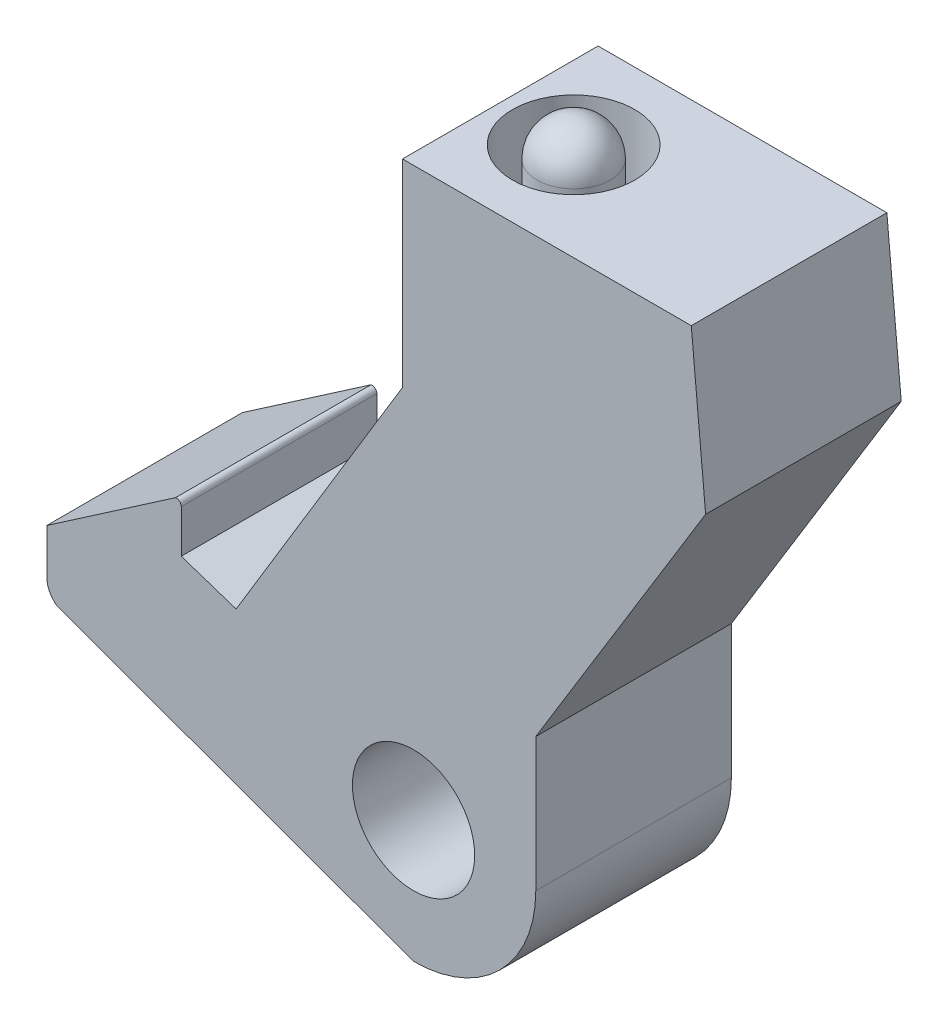
ISO-10303-21;
HEADER;
FILE_DESCRIPTION(('STEP AP214'),'2;1');
FILE_NAME('part.step','',(''),(''),'','','');
FILE_SCHEMA(('AUTOMOTIVE_DESIGN { 1 0 10303 214 1 1 1 1 }'));
ENDSEC;
DATA;
#1=APPLICATION_CONTEXT('core data for automotive mechanical design processes');
#2=APPLICATION_PROTOCOL_DEFINITION('international standard','automotive_design',2000,#1);
#3=PRODUCT_CONTEXT('',#1,'mechanical');
#4=PRODUCT('Part','Part','',(#3));
#5=PRODUCT_RELATED_PRODUCT_CATEGORY('part','',(#4));
#6=PRODUCT_DEFINITION_FORMATION('','',#4);
#7=PRODUCT_DEFINITION_CONTEXT('part definition',#1,'design');
#8=PRODUCT_DEFINITION('design','',#6,#7);
#9=PRODUCT_DEFINITION_SHAPE('','',#8);
#10=(LENGTH_UNIT() NAMED_UNIT(*) SI_UNIT(.MILLI.,.METRE.));
#11=(NAMED_UNIT(*) PLANE_ANGLE_UNIT() SI_UNIT($,.RADIAN.));
#12=(NAMED_UNIT(*) SI_UNIT($,.STERADIAN.) SOLID_ANGLE_UNIT());
#13=UNCERTAINTY_MEASURE_WITH_UNIT(LENGTH_MEASURE(1.E-05),#10,'distance_accuracy_value','');
#14=(GEOMETRIC_REPRESENTATION_CONTEXT(3) GLOBAL_UNCERTAINTY_ASSIGNED_CONTEXT((#13)) GLOBAL_UNIT_ASSIGNED_CONTEXT((#10,
#11,#12)) REPRESENTATION_CONTEXT('',''));
#15=CARTESIAN_POINT('',(0.,0.,0.));
#16=DIRECTION('',(0.,0.,1.));
#17=DIRECTION('',(1.,0.,0.));
#18=AXIS2_PLACEMENT_3D('',#15,#16,#17);
#19=CARTESIAN_POINT('',(-9.7,6.35896081746884,8.));
#20=DIRECTION('',(0.,0.,-1.));
#21=DIRECTION('',(-1.,0.,0.));
#22=AXIS2_PLACEMENT_3D('',#19,#20,#21);
#23=PLANE('',#22);
#24=DIRECTION('',(-1.,0.,0.));
#25=VECTOR('',#24,1.);
#26=CARTESIAN_POINT('',(11.3590150208079,23.1958998029611,8.));
#27=LINE('',#26,#25);
#28=CARTESIAN_POINT('',(11.3590150208079,23.1958998029611,8.));
#29=VERTEX_POINT('',#28);
#30=CARTESIAN_POINT('',(-0.451148657404046,23.1958998029611,8.));
#31=VERTEX_POINT('',#30);
#32=EDGE_CURVE('E194',#29,#31,#27,.T.);
#33=ORIENTED_EDGE('',*,*,#32,.T.);
#34=DIRECTION('',(0.,-1.,0.));
#35=VECTOR('',#34,1.);
#36=CARTESIAN_POINT('',(-0.451148657404047,21.8755314878272,8.));
#37=LINE('',#36,#35);
#38=CARTESIAN_POINT('',(-0.451148657404047,15.1014958015658,8.));
#39=VERTEX_POINT('',#38);
#40=EDGE_CURVE('E111',#31,#39,#37,.T.);
#41=ORIENTED_EDGE('',*,*,#40,.T.);
#42=DIRECTION('',(-0.517671811469476,-0.855579274883346,0.));
#43=VECTOR('',#42,1.);
#44=CARTESIAN_POINT('',(-7.25812043141713,3.85131017135029,8.));
#45=LINE('',#44,#43);
#46=CARTESIAN_POINT('',(-7.25812043141713,3.85131017135029,8.));
#47=VERTEX_POINT('',#46);
#48=EDGE_CURVE('E319',#39,#47,#45,.T.);
#49=ORIENTED_EDGE('',*,*,#48,.T.);
#50=DIRECTION('',(-0.948683298050514,0.316227766016838,0.));
#51=VECTOR('',#50,1.);
#52=CARTESIAN_POINT('',(-7.25812043141713,3.85131017135029,8.));
#53=LINE('',#52,#51);
#54=CARTESIAN_POINT('',(-9.5,4.59860336087792,8.));
#55=VERTEX_POINT('',#54);
#56=EDGE_CURVE('E321',#47,#55,#53,.T.);
#57=ORIENTED_EDGE('',*,*,#56,.T.);
#58=DIRECTION('',(0.,1.,0.));
#59=VECTOR('',#58,1.);
#60=CARTESIAN_POINT('',(-9.5,6.35896081746884,8.));
#61=LINE('',#60,#59);
#62=CARTESIAN_POINT('',(-9.5,6.35896081746884,8.));
#63=VERTEX_POINT('',#62);
#64=EDGE_CURVE('E323',#55,#63,#61,.T.);
#65=ORIENTED_EDGE('',*,*,#64,.T.);
#66=CARTESIAN_POINT('',(-9.7,6.35896081746884,8.));
#67=DIRECTION('',(0.,0.,1.));
#68=DIRECTION('',(-1.,0.,0.));
#69=AXIS2_PLACEMENT_3D('',#66,#67,#68);
#70=CIRCLE('',#69,0.200000000000001);
#71=CARTESIAN_POINT('',(-9.73577708764,6.55573479948883,8.));
#72=VERTEX_POINT('',#71);
#73=EDGE_CURVE('E329',#63,#72,#70,.T.);
#74=ORIENTED_EDGE('',*,*,#73,.T.);
#75=DIRECTION('',(-0.824143897152437,-0.566380469990265,0.));
#76=VECTOR('',#75,1.);
#77=CARTESIAN_POINT('',(-9.73577708764,6.55573479948883,8.));
#78=LINE('',#77,#76);
#79=CARTESIAN_POINT('',(-15.,2.93797695703222,8.));
#80=VERTEX_POINT('',#79);
#81=EDGE_CURVE('E331',#72,#80,#78,.T.);
#82=ORIENTED_EDGE('',*,*,#81,.T.);
#83=DIRECTION('',(0.,-1.,0.));
#84=VECTOR('',#83,1.);
#85=CARTESIAN_POINT('',(-15.,1.11192690659553,8.));
#86=LINE('',#85,#84);
#87=CARTESIAN_POINT('',(-15.,1.11192690659553,8.));
#88=VERTEX_POINT('',#87);
#89=EDGE_CURVE('E333',#80,#88,#86,.T.);
#90=ORIENTED_EDGE('',*,*,#89,.T.);
#91=CARTESIAN_POINT('',(-14.,1.11192690659553,8.));
#92=DIRECTION('',(0.,0.,1.));
#93=DIRECTION('',(-1.,0.,0.));
#94=AXIS2_PLACEMENT_3D('',#91,#92,#93);
#95=CIRCLE('',#94,1.);
#96=CARTESIAN_POINT('',(-14.5829032987937,0.299385372730662,8.));
#97=VERTEX_POINT('',#96);
#98=EDGE_CURVE('E335',#88,#97,#95,.T.);
#99=ORIENTED_EDGE('',*,*,#98,.T.);
#100=DIRECTION('',(0.939865612839729,-0.341544477047134,0.));
#101=VECTOR('',#100,1.);
#102=CARTESIAN_POINT('',(-14.5829032987937,0.299385372730663,8.));
#103=LINE('',#102,#101);
#104=CARTESIAN_POINT('',(0.,-5.,8.));
#105=VERTEX_POINT('',#104);
#106=EDGE_CURVE('E337',#97,#105,#103,.T.);
#107=ORIENTED_EDGE('',*,*,#106,.T.);
#108=CARTESIAN_POINT('',(0.,0.,8.));
#109=DIRECTION('',(0.,0.,1.));
#110=DIRECTION('',(1.,0.,0.));
#111=AXIS2_PLACEMENT_3D('',#108,#109,#110);
#112=CIRCLE('',#111,5.);
#113=CARTESIAN_POINT('',(5.,0.,8.));
#114=VERTEX_POINT('',#113);
#115=EDGE_CURVE('E148',#105,#114,#112,.T.);
#116=ORIENTED_EDGE('',*,*,#115,.T.);
#117=DIRECTION('',(0.,1.,0.));
#118=VECTOR('',#117,1.);
#119=CARTESIAN_POINT('',(5.,0.,8.));
#120=LINE('',#119,#118);
#121=CARTESIAN_POINT('',(5.,5.46493445676788,8.));
#122=VERTEX_POINT('',#121);
#123=EDGE_CURVE('E142',#114,#122,#120,.T.);
#124=ORIENTED_EDGE('',*,*,#123,.T.);
#125=DIRECTION('',(0.522230594168643,0.852804319005401,0.));
#126=VECTOR('',#125,1.);
#127=CARTESIAN_POINT('',(10.1123290730016,13.8133850498879,8.));
#128=LINE('',#127,#126);
#129=CARTESIAN_POINT('',(11.9457969008374,16.8074441873556,8.));
#130=VERTEX_POINT('',#129);
#131=EDGE_CURVE('E146',#122,#130,#128,.T.);
#132=ORIENTED_EDGE('',*,*,#131,.T.);
#133=DIRECTION('',(-0.0914653366253022,0.995808260759078,0.));
#134=VECTOR('',#133,1.);
#135=CARTESIAN_POINT('',(11.9457969008374,16.8074441873556,8.));
#136=LINE('',#135,#134);
#137=EDGE_CURVE('E50',#130,#29,#136,.T.);
#138=ORIENTED_EDGE('',*,*,#137,.T.);
#139=EDGE_LOOP('',(#33,#41,#49,#57,#65,#74,#82,#90,#99,#107,#116,#124,#132,#138));
#140=FACE_BOUND('',#139,.T.);
#141=CARTESIAN_POINT('',(0.,0.,8.));
#142=DIRECTION('',(0.,0.,1.));
#143=DIRECTION('',(1.,0.,0.));
#144=AXIS2_PLACEMENT_3D('',#141,#142,#143);
#145=CIRCLE('',#144,2.5);
#146=CARTESIAN_POINT('',(2.5,0.,8.));
#147=VERTEX_POINT('',#146);
#148=EDGE_CURVE('E170',#147,#147,#145,.T.);
#149=ORIENTED_EDGE('',*,*,#148,.F.);
#150=EDGE_LOOP('',(#149));
#151=FACE_BOUND('',#150,.T.);
#152=ADVANCED_FACE('F33',(#140,#151),#23,.F.);
#153=CARTESIAN_POINT('',(-9.7,6.35896081746884,0.));
#154=DIRECTION('',(0.,0.,-1.));
#155=DIRECTION('',(-1.,0.,0.));
#156=AXIS2_PLACEMENT_3D('',#153,#154,#155);
#157=PLANE('',#156);
#158=DIRECTION('',(-1.,0.,0.));
#159=VECTOR('',#158,1.);
#160=CARTESIAN_POINT('',(11.3590150208079,23.1958998029611,0.));
#161=LINE('',#160,#159);
#162=CARTESIAN_POINT('',(11.3590150208079,23.1958998029611,0.));
#163=VERTEX_POINT('',#162);
#164=CARTESIAN_POINT('',(-0.451148657404046,23.1958998029611,0.));
#165=VERTEX_POINT('',#164);
#166=EDGE_CURVE('E166',#163,#165,#161,.T.);
#167=ORIENTED_EDGE('',*,*,#166,.F.);
#168=DIRECTION('',(-0.0914653366253022,0.995808260759078,0.));
#169=VECTOR('',#168,1.);
#170=CARTESIAN_POINT('',(11.9457969008374,16.8074441873556,0.));
#171=LINE('',#170,#169);
#172=CARTESIAN_POINT('',(11.9457969008374,16.8074441873556,0.));
#173=VERTEX_POINT('',#172);
#174=EDGE_CURVE('E102',#173,#163,#171,.T.);
#175=ORIENTED_EDGE('',*,*,#174,.F.);
#176=DIRECTION('',(0.522230594168643,0.852804319005401,0.));
#177=VECTOR('',#176,1.);
#178=CARTESIAN_POINT('',(10.1123290730016,13.8133850498879,0.));
#179=LINE('',#178,#177);
#180=CARTESIAN_POINT('',(5.,5.46493445676788,0.));
#181=VERTEX_POINT('',#180);
#182=EDGE_CURVE('E96',#181,#173,#179,.T.);
#183=ORIENTED_EDGE('',*,*,#182,.F.);
#184=DIRECTION('',(0.,1.,0.));
#185=VECTOR('',#184,1.);
#186=CARTESIAN_POINT('',(5.,5.46493445676788,0.));
#187=LINE('',#186,#185);
#188=CARTESIAN_POINT('',(5.,0.,0.));
#189=VERTEX_POINT('',#188);
#190=EDGE_CURVE('E156',#189,#181,#187,.T.);
#191=ORIENTED_EDGE('',*,*,#190,.F.);
#192=CARTESIAN_POINT('',(0.,0.,0.));
#193=DIRECTION('',(0.,0.,1.));
#194=DIRECTION('',(1.,0.,0.));
#195=AXIS2_PLACEMENT_3D('',#192,#193,#194);
#196=CIRCLE('',#195,5.);
#197=CARTESIAN_POINT('',(0.,-5.,0.));
#198=VERTEX_POINT('',#197);
#199=EDGE_CURVE('E188',#198,#189,#196,.T.);
#200=ORIENTED_EDGE('',*,*,#199,.F.);
#201=DIRECTION('',(0.939865612839729,-0.341544477047134,0.));
#202=VECTOR('',#201,1.);
#203=CARTESIAN_POINT('',(-14.5829032987937,0.299385372730663,0.));
#204=LINE('',#203,#202);
#205=CARTESIAN_POINT('',(-14.5829032987937,0.299385372730662,0.));
#206=VERTEX_POINT('',#205);
#207=EDGE_CURVE('E186',#206,#198,#204,.T.);
#208=ORIENTED_EDGE('',*,*,#207,.F.);
#209=CARTESIAN_POINT('',(-14.,1.11192690659553,0.));
#210=DIRECTION('',(0.,0.,1.));
#211=DIRECTION('',(-1.,0.,0.));
#212=AXIS2_PLACEMENT_3D('',#209,#210,#211);
#213=CIRCLE('',#212,1.);
#214=CARTESIAN_POINT('',(-15.,1.11192690659553,0.));
#215=VERTEX_POINT('',#214);
#216=EDGE_CURVE('E184',#215,#206,#213,.T.);
#217=ORIENTED_EDGE('',*,*,#216,.F.);
#218=DIRECTION('',(0.,-1.,0.));
#219=VECTOR('',#218,1.);
#220=CARTESIAN_POINT('',(-15.,1.11192690659553,0.));
#221=LINE('',#220,#219);
#222=CARTESIAN_POINT('',(-15.,2.93797695703222,0.));
#223=VERTEX_POINT('',#222);
#224=EDGE_CURVE('E182',#223,#215,#221,.T.);
#225=ORIENTED_EDGE('',*,*,#224,.F.);
#226=DIRECTION('',(-0.824143897152437,-0.566380469990265,0.));
#227=VECTOR('',#226,1.);
#228=CARTESIAN_POINT('',(-9.73577708764,6.55573479948883,0.));
#229=LINE('',#228,#227);
#230=CARTESIAN_POINT('',(-9.73577708764,6.55573479948883,0.));
#231=VERTEX_POINT('',#230);
#232=EDGE_CURVE('E180',#231,#223,#229,.T.);
#233=ORIENTED_EDGE('',*,*,#232,.F.);
#234=CARTESIAN_POINT('',(-9.7,6.35896081746884,0.));
#235=DIRECTION('',(0.,0.,1.));
#236=DIRECTION('',(-1.,0.,0.));
#237=AXIS2_PLACEMENT_3D('',#234,#235,#236);
#238=CIRCLE('',#237,0.200000000000001);
#239=CARTESIAN_POINT('',(-9.5,6.35896081746884,0.));
#240=VERTEX_POINT('',#239);
#241=EDGE_CURVE('E178',#240,#231,#238,.T.);
#242=ORIENTED_EDGE('',*,*,#241,.F.);
#243=DIRECTION('',(0.,1.,0.));
#244=VECTOR('',#243,1.);
#245=CARTESIAN_POINT('',(-9.5,6.35896081746884,0.));
#246=LINE('',#245,#244);
#247=CARTESIAN_POINT('',(-9.5,4.59860336087792,0.));
#248=VERTEX_POINT('',#247);
#249=EDGE_CURVE('E176',#248,#240,#246,.T.);
#250=ORIENTED_EDGE('',*,*,#249,.F.);
#251=DIRECTION('',(-0.948683298050514,0.316227766016838,0.));
#252=VECTOR('',#251,1.);
#253=CARTESIAN_POINT('',(-7.25812043141713,3.85131017135029,0.));
#254=LINE('',#253,#252);
#255=CARTESIAN_POINT('',(-7.25812043141713,3.85131017135029,0.));
#256=VERTEX_POINT('',#255);
#257=EDGE_CURVE('E174',#256,#248,#254,.T.);
#258=ORIENTED_EDGE('',*,*,#257,.F.);
#259=DIRECTION('',(-0.517671811469476,-0.855579274883346,0.));
#260=VECTOR('',#259,1.);
#261=CARTESIAN_POINT('',(-7.25812043141713,3.85131017135029,0.));
#262=LINE('',#261,#260);
#263=CARTESIAN_POINT('',(-0.451148657404047,15.1014958015658,0.));
#264=VERTEX_POINT('',#263);
#265=EDGE_CURVE('E172',#264,#256,#262,.T.);
#266=ORIENTED_EDGE('',*,*,#265,.F.);
#267=DIRECTION('',(0.,-1.,0.));
#268=VECTOR('',#267,1.);
#269=CARTESIAN_POINT('',(-0.451148657404047,15.1014958015658,0.));
#270=LINE('',#269,#268);
#271=EDGE_CURVE('E169',#165,#264,#270,.T.);
#272=ORIENTED_EDGE('',*,*,#271,.F.);
#273=EDGE_LOOP('',(#167,#175,#183,#191,#200,#208,#217,#225,#233,#242,#250,#258,#266,#272));
#274=FACE_BOUND('',#273,.T.);
#275=CARTESIAN_POINT('',(0.,0.,0.));
#276=DIRECTION('',(0.,0.,1.));
#277=DIRECTION('',(1.,0.,0.));
#278=AXIS2_PLACEMENT_3D('',#275,#276,#277);
#279=CIRCLE('',#278,2.5);
#280=CARTESIAN_POINT('',(2.5,0.,0.));
#281=VERTEX_POINT('',#280);
#282=EDGE_CURVE('E360',#281,#281,#279,.T.);
#283=ORIENTED_EDGE('',*,*,#282,.T.);
#284=EDGE_LOOP('',(#283));
#285=FACE_BOUND('',#284,.T.);
#286=ADVANCED_FACE('F246',(#274,#285),#157,.T.);
#287=CARTESIAN_POINT('',(11.3590150208079,23.1958998029611,8.));
#288=DIRECTION('',(0.,-1.,0.));
#289=DIRECTION('',(0.,0.,-1.));
#290=AXIS2_PLACEMENT_3D('',#287,#288,#289);
#291=PLANE('',#290);
#292=CARTESIAN_POINT('',(2.54885134259595,23.1958998029611,4.));
#293=DIRECTION('',(0.,1.,0.));
#294=DIRECTION('',(0.,0.,1.));
#295=AXIS2_PLACEMENT_3D('',#292,#293,#294);
#296=CIRCLE('',#295,2.5);
#297=CARTESIAN_POINT('',(2.54885134259595,23.1958998029611,6.5));
#298=VERTEX_POINT('',#297);
#299=EDGE_CURVE('E310',#298,#298,#296,.T.);
#300=ORIENTED_EDGE('',*,*,#299,.F.);
#301=EDGE_LOOP('',(#300));
#302=FACE_BOUND('',#301,.T.);
#303=ORIENTED_EDGE('',*,*,#166,.T.);
#304=DIRECTION('',(0.,0.,-1.));
#305=VECTOR('',#304,1.);
#306=CARTESIAN_POINT('',(-0.451148657404046,23.1958998029611,8.));
#307=LINE('',#306,#305);
#308=EDGE_CURVE('E225',#31,#165,#307,.T.);
#309=ORIENTED_EDGE('',*,*,#308,.F.);
#310=ORIENTED_EDGE('',*,*,#32,.F.);
#311=DIRECTION('',(0.,0.,-1.));
#312=VECTOR('',#311,1.);
#313=CARTESIAN_POINT('',(11.3590150208079,23.1958998029611,8.));
#314=LINE('',#313,#312);
#315=EDGE_CURVE('E162',#29,#163,#314,.T.);
#316=ORIENTED_EDGE('',*,*,#315,.T.);
#317=EDGE_LOOP('',(#303,#309,#310,#316));
#318=FACE_BOUND('',#317,.T.);
#319=ADVANCED_FACE('F251',(#302,#318),#291,.F.);
#320=CARTESIAN_POINT('',(-0.451148657404047,15.1014958015658,8.));
#321=DIRECTION('',(1.,0.,0.));
#322=DIRECTION('',(0.,0.,-1.));
#323=AXIS2_PLACEMENT_3D('',#320,#321,#322);
#324=PLANE('',#323);
#325=ORIENTED_EDGE('',*,*,#271,.T.);
#326=DIRECTION('',(0.,0.,-1.));
#327=VECTOR('',#326,1.);
#328=CARTESIAN_POINT('',(-0.451148657404047,15.1014958015658,8.));
#329=LINE('',#328,#327);
#330=EDGE_CURVE('E222',#39,#264,#329,.T.);
#331=ORIENTED_EDGE('',*,*,#330,.F.);
#332=ORIENTED_EDGE('',*,*,#40,.F.);
#333=ORIENTED_EDGE('',*,*,#308,.T.);
#334=EDGE_LOOP('',(#325,#331,#332,#333));
#335=FACE_BOUND('',#334,.T.);
#336=ADVANCED_FACE('F300',(#335),#324,.F.);
#337=CARTESIAN_POINT('',(-7.25812043141713,3.85131017135029,8.));
#338=DIRECTION('',(0.855579274883346,-0.517671811469476,0.));
#339=DIRECTION('',(0.517671811469476,0.855579274883346,0.));
#340=AXIS2_PLACEMENT_3D('',#337,#338,#339);
#341=PLANE('',#340);
#342=ORIENTED_EDGE('',*,*,#265,.T.);
#343=DIRECTION('',(0.,0.,-1.));
#344=VECTOR('',#343,1.);
#345=CARTESIAN_POINT('',(-7.25812043141713,3.85131017135029,8.));
#346=LINE('',#345,#344);
#347=EDGE_CURVE('E219',#47,#256,#346,.T.);
#348=ORIENTED_EDGE('',*,*,#347,.F.);
#349=ORIENTED_EDGE('',*,*,#48,.F.);
#350=ORIENTED_EDGE('',*,*,#330,.T.);
#351=EDGE_LOOP('',(#342,#348,#349,#350));
#352=FACE_BOUND('',#351,.T.);
#353=ADVANCED_FACE('F296',(#352),#341,.F.);
#354=CARTESIAN_POINT('',(-7.25812043141713,3.85131017135029,8.));
#355=DIRECTION('',(-0.316227766016838,-0.948683298050514,0.));
#356=DIRECTION('',(0.948683298050514,-0.316227766016838,0.));
#357=AXIS2_PLACEMENT_3D('',#354,#355,#356);
#358=PLANE('',#357);
#359=ORIENTED_EDGE('',*,*,#257,.T.);
#360=DIRECTION('',(0.,0.,-1.));
#361=VECTOR('',#360,1.);
#362=CARTESIAN_POINT('',(-9.5,4.59860336087792,8.));
#363=LINE('',#362,#361);
#364=EDGE_CURVE('E216',#55,#248,#363,.T.);
#365=ORIENTED_EDGE('',*,*,#364,.F.);
#366=ORIENTED_EDGE('',*,*,#56,.F.);
#367=ORIENTED_EDGE('',*,*,#347,.T.);
#368=EDGE_LOOP('',(#359,#365,#366,#367));
#369=FACE_BOUND('',#368,.T.);
#370=ADVANCED_FACE('F292',(#369),#358,.F.);
#371=CARTESIAN_POINT('',(-9.5,6.35896081746884,8.));
#372=DIRECTION('',(-1.,0.,0.));
#373=DIRECTION('',(0.,-1.,0.));
#374=AXIS2_PLACEMENT_3D('',#371,#372,#373);
#375=PLANE('',#374);
#376=ORIENTED_EDGE('',*,*,#249,.T.);
#377=DIRECTION('',(0.,0.,-1.));
#378=VECTOR('',#377,1.);
#379=CARTESIAN_POINT('',(-9.5,6.35896081746884,8.));
#380=LINE('',#379,#378);
#381=EDGE_CURVE('E213',#63,#240,#380,.T.);
#382=ORIENTED_EDGE('',*,*,#381,.F.);
#383=ORIENTED_EDGE('',*,*,#64,.F.);
#384=ORIENTED_EDGE('',*,*,#364,.T.);
#385=EDGE_LOOP('',(#376,#382,#383,#384));
#386=FACE_BOUND('',#385,.T.);
#387=ADVANCED_FACE('F288',(#386),#375,.F.);
#388=CARTESIAN_POINT('',(-9.7,6.35896081746884,8.));
#389=DIRECTION('',(0.,0.,-1.));
#390=DIRECTION('',(-1.,0.,0.));
#391=AXIS2_PLACEMENT_3D('',#388,#389,#390);
#392=CYLINDRICAL_SURFACE('',#391,0.200000000000001);
#393=ORIENTED_EDGE('',*,*,#241,.T.);
#394=DIRECTION('',(0.,0.,-1.));
#395=VECTOR('',#394,1.);
#396=CARTESIAN_POINT('',(-9.73577708764,6.55573479948883,8.));
#397=LINE('',#396,#395);
#398=EDGE_CURVE('E210',#72,#231,#397,.T.);
#399=ORIENTED_EDGE('',*,*,#398,.F.);
#400=ORIENTED_EDGE('',*,*,#73,.F.);
#401=ORIENTED_EDGE('',*,*,#381,.T.);
#402=EDGE_LOOP('',(#393,#399,#400,#401));
#403=FACE_BOUND('',#402,.T.);
#404=ADVANCED_FACE('F284',(#403),#392,.T.);
#405=CARTESIAN_POINT('',(-9.73577708764,6.55573479948883,8.));
#406=DIRECTION('',(0.566380469990265,-0.824143897152437,0.));
#407=DIRECTION('',(0.824143897152437,0.566380469990265,0.));
#408=AXIS2_PLACEMENT_3D('',#405,#406,#407);
#409=PLANE('',#408);
#410=ORIENTED_EDGE('',*,*,#232,.T.);
#411=DIRECTION('',(0.,0.,-1.));
#412=VECTOR('',#411,1.);
#413=CARTESIAN_POINT('',(-15.,2.93797695703222,8.));
#414=LINE('',#413,#412);
#415=EDGE_CURVE('E207',#80,#223,#414,.T.);
#416=ORIENTED_EDGE('',*,*,#415,.F.);
#417=ORIENTED_EDGE('',*,*,#81,.F.);
#418=ORIENTED_EDGE('',*,*,#398,.T.);
#419=EDGE_LOOP('',(#410,#416,#417,#418));
#420=FACE_BOUND('',#419,.T.);
#421=ADVANCED_FACE('F280',(#420),#409,.F.);
#422=CARTESIAN_POINT('',(-15.,1.11192690659553,8.));
#423=DIRECTION('',(1.,0.,0.));
#424=DIRECTION('',(0.,0.,-1.));
#425=AXIS2_PLACEMENT_3D('',#422,#423,#424);
#426=PLANE('',#425);
#427=ORIENTED_EDGE('',*,*,#224,.T.);
#428=DIRECTION('',(0.,0.,-1.));
#429=VECTOR('',#428,1.);
#430=CARTESIAN_POINT('',(-15.,1.11192690659553,8.));
#431=LINE('',#430,#429);
#432=EDGE_CURVE('E204',#88,#215,#431,.T.);
#433=ORIENTED_EDGE('',*,*,#432,.F.);
#434=ORIENTED_EDGE('',*,*,#89,.F.);
#435=ORIENTED_EDGE('',*,*,#415,.T.);
#436=EDGE_LOOP('',(#427,#433,#434,#435));
#437=FACE_BOUND('',#436,.T.);
#438=ADVANCED_FACE('F276',(#437),#426,.F.);
#439=CARTESIAN_POINT('',(-14.,1.11192690659553,8.));
#440=DIRECTION('',(0.,0.,-1.));
#441=DIRECTION('',(-1.,0.,0.));
#442=AXIS2_PLACEMENT_3D('',#439,#440,#441);
#443=CYLINDRICAL_SURFACE('',#442,1.);
#444=ORIENTED_EDGE('',*,*,#216,.T.);
#445=DIRECTION('',(0.,0.,-1.));
#446=VECTOR('',#445,1.);
#447=CARTESIAN_POINT('',(-14.5829032987937,0.299385372730662,8.));
#448=LINE('',#447,#446);
#449=EDGE_CURVE('E201',#97,#206,#448,.T.);
#450=ORIENTED_EDGE('',*,*,#449,.F.);
#451=ORIENTED_EDGE('',*,*,#98,.F.);
#452=ORIENTED_EDGE('',*,*,#432,.T.);
#453=EDGE_LOOP('',(#444,#450,#451,#452));
#454=FACE_BOUND('',#453,.T.);
#455=ADVANCED_FACE('F272',(#454),#443,.T.);
#456=CARTESIAN_POINT('',(-14.5829032987937,0.299385372730663,8.));
#457=DIRECTION('',(0.341544477047134,0.939865612839729,0.));
#458=DIRECTION('',(-0.939865612839729,0.341544477047134,0.));
#459=AXIS2_PLACEMENT_3D('',#456,#457,#458);
#460=PLANE('',#459);
#461=CARTESIAN_POINT('',(-10.9371774740952,-1.02546097045201,4.));
#462=DIRECTION('',(-0.341544477047134,-0.939865612839729,0.));
#463=DIRECTION('',(0.939865612839729,-0.341544477047134,0.));
#464=AXIS2_PLACEMENT_3D('',#461,#462,#463);
#465=CIRCLE('',#464,3.);
#466=CARTESIAN_POINT('',(-8.11758063557606,-2.05009440159341,4.));
#467=VERTEX_POINT('',#466);
#468=EDGE_CURVE('E366',#467,#467,#465,.T.);
#469=ORIENTED_EDGE('',*,*,#468,.F.);
#470=EDGE_LOOP('',(#469));
#471=FACE_BOUND('',#470,.T.);
#472=ORIENTED_EDGE('',*,*,#207,.T.);
#473=DIRECTION('',(0.,0.,-1.));
#474=VECTOR('',#473,1.);
#475=CARTESIAN_POINT('',(0.,-5.,8.));
#476=LINE('',#475,#474);
#477=EDGE_CURVE('E198',#105,#198,#476,.T.);
#478=ORIENTED_EDGE('',*,*,#477,.F.);
#479=ORIENTED_EDGE('',*,*,#106,.F.);
#480=ORIENTED_EDGE('',*,*,#449,.T.);
#481=EDGE_LOOP('',(#472,#478,#479,#480));
#482=FACE_BOUND('',#481,.T.);
#483=ADVANCED_FACE('F268',(#471,#482),#460,.F.);
#484=CARTESIAN_POINT('',(0.,0.,8.));
#485=DIRECTION('',(0.,0.,-1.));
#486=DIRECTION('',(-1.,0.,0.));
#487=AXIS2_PLACEMENT_3D('',#484,#485,#486);
#488=CYLINDRICAL_SURFACE('',#487,5.);
#489=ORIENTED_EDGE('',*,*,#199,.T.);
#490=DIRECTION('',(0.,0.,-1.));
#491=VECTOR('',#490,1.);
#492=CARTESIAN_POINT('',(5.,0.,8.));
#493=LINE('',#492,#491);
#494=EDGE_CURVE('E157',#114,#189,#493,.T.);
#495=ORIENTED_EDGE('',*,*,#494,.F.);
#496=ORIENTED_EDGE('',*,*,#115,.F.);
#497=ORIENTED_EDGE('',*,*,#477,.T.);
#498=EDGE_LOOP('',(#489,#495,#496,#497));
#499=FACE_BOUND('',#498,.T.);
#500=ADVANCED_FACE('F265',(#499),#488,.T.);
#501=CARTESIAN_POINT('',(5.,5.46493445676788,8.));
#502=DIRECTION('',(-1.,0.,0.));
#503=DIRECTION('',(0.,0.,1.));
#504=AXIS2_PLACEMENT_3D('',#501,#502,#503);
#505=PLANE('',#504);
#506=ORIENTED_EDGE('',*,*,#190,.T.);
#507=DIRECTION('',(0.,0.,-1.));
#508=VECTOR('',#507,1.);
#509=CARTESIAN_POINT('',(5.,5.46493445676788,8.));
#510=LINE('',#509,#508);
#511=EDGE_CURVE('E154',#122,#181,#510,.T.);
#512=ORIENTED_EDGE('',*,*,#511,.F.);
#513=ORIENTED_EDGE('',*,*,#123,.F.);
#514=ORIENTED_EDGE('',*,*,#494,.T.);
#515=EDGE_LOOP('',(#506,#512,#513,#514));
#516=FACE_BOUND('',#515,.T.);
#517=ADVANCED_FACE('F155',(#516),#505,.F.);
#518=CARTESIAN_POINT('',(10.1123290730016,13.8133850498879,8.));
#519=DIRECTION('',(-0.852804319005401,0.522230594168643,0.));
#520=DIRECTION('',(-0.522230594168643,-0.852804319005401,0.));
#521=AXIS2_PLACEMENT_3D('',#518,#519,#520);
#522=PLANE('',#521);
#523=ORIENTED_EDGE('',*,*,#182,.T.);
#524=DIRECTION('',(0.,0.,-1.));
#525=VECTOR('',#524,1.);
#526=CARTESIAN_POINT('',(11.9457969008374,16.8074441873556,8.));
#527=LINE('',#526,#525);
#528=EDGE_CURVE('E158',#130,#173,#527,.T.);
#529=ORIENTED_EDGE('',*,*,#528,.F.);
#530=ORIENTED_EDGE('',*,*,#131,.F.);
#531=ORIENTED_EDGE('',*,*,#511,.T.);
#532=EDGE_LOOP('',(#523,#529,#530,#531));
#533=FACE_BOUND('',#532,.T.);
#534=ADVANCED_FACE('F160',(#533),#522,.F.);
#535=CARTESIAN_POINT('',(11.9457969008374,16.8074441873556,8.));
#536=DIRECTION('',(-0.995808260759078,-0.0914653366253022,0.));
#537=DIRECTION('',(0.0914653366253022,-0.995808260759078,0.));
#538=AXIS2_PLACEMENT_3D('',#535,#536,#537);
#539=PLANE('',#538);
#540=ORIENTED_EDGE('',*,*,#174,.T.);
#541=ORIENTED_EDGE('',*,*,#315,.F.);
#542=ORIENTED_EDGE('',*,*,#137,.F.);
#543=ORIENTED_EDGE('',*,*,#528,.T.);
#544=EDGE_LOOP('',(#540,#541,#542,#543));
#545=FACE_BOUND('',#544,.T.);
#546=ADVANCED_FACE('F258',(#545),#539,.F.);
#547=CARTESIAN_POINT('',(0.,0.,8.));
#548=DIRECTION('',(0.,0.,-1.));
#549=DIRECTION('',(-1.,0.,0.));
#550=AXIS2_PLACEMENT_3D('',#547,#548,#549);
#551=CYLINDRICAL_SURFACE('',#550,2.5);
#552=ORIENTED_EDGE('',*,*,#148,.T.);
#553=EDGE_LOOP('',(#552));
#554=FACE_BOUND('',#553,.T.);
#555=ORIENTED_EDGE('',*,*,#282,.F.);
#556=EDGE_LOOP('',(#555));
#557=FACE_BOUND('',#556,.T.);
#558=ADVANCED_FACE('F255',(#554,#557),#551,.F.);
#559=CARTESIAN_POINT('',(-9.91254404295385,1.79413586806718,4.));
#560=DIRECTION('',(-0.341544477047134,-0.939865612839729,0.));
#561=DIRECTION('',(0.939865612839729,-0.341544477047134,0.));
#562=AXIS2_PLACEMENT_3D('',#559,#560,#561);
#563=CYLINDRICAL_SURFACE('',#562,3.);
#564=CARTESIAN_POINT('',(-9.91254404295385,1.79413586806718,4.));
#565=DIRECTION('',(-0.341544477047134,-0.939865612839729,0.));
#566=DIRECTION('',(0.939865612839729,-0.341544477047134,0.));
#567=AXIS2_PLACEMENT_3D('',#564,#565,#566);
#568=CIRCLE('',#567,3.);
#569=CARTESIAN_POINT('',(-7.09294720443466,0.769502436925783,4.));
#570=VERTEX_POINT('',#569);
#571=EDGE_CURVE('E363',#570,#570,#568,.T.);
#572=ORIENTED_EDGE('',*,*,#571,.F.);
#573=EDGE_LOOP('',(#572));
#574=FACE_BOUND('',#573,.T.);
#575=ORIENTED_EDGE('',*,*,#468,.T.);
#576=EDGE_LOOP('',(#575));
#577=FACE_BOUND('',#576,.T.);
#578=ADVANCED_FACE('F396',(#574,#577),#563,.F.);
#579=CARTESIAN_POINT('',(-9.91254404295385,1.79413586806718,4.));
#580=DIRECTION('',(-0.341544477047134,-0.939865612839729,0.));
#581=DIRECTION('',(0.939865612839729,-0.341544477047134,0.));
#582=AXIS2_PLACEMENT_3D('',#579,#580,#581);
#583=PLANE('',#582);
#584=CARTESIAN_POINT('',(-9.91254404295385,1.79413586806718,4.));
#585=DIRECTION('',(-0.341544477047134,-0.939865612839729,0.));
#586=DIRECTION('',(0.939865612839729,-0.341544477047134,0.));
#587=AXIS2_PLACEMENT_3D('',#584,#585,#586);
#588=CIRCLE('',#587,2.);
#589=CARTESIAN_POINT('',(-8.03281281727439,1.11104691397292,4.));
#590=VERTEX_POINT('',#589);
#591=EDGE_CURVE('E369',#590,#590,#588,.T.);
#592=ORIENTED_EDGE('',*,*,#591,.F.);
#593=EDGE_LOOP('',(#592));
#594=FACE_BOUND('',#593,.T.);
#595=ORIENTED_EDGE('',*,*,#571,.T.);
#596=EDGE_LOOP('',(#595));
#597=FACE_BOUND('',#596,.T.);
#598=ADVANCED_FACE('F242',(#594,#597),#583,.T.);
#599=CARTESIAN_POINT('',(-10.9371774740952,-1.025460970452,4.));
#600=DIRECTION('',(0.341544477047134,0.939865612839729,0.));
#601=DIRECTION('',(-0.939865612839729,0.341544477047134,0.));
#602=AXIS2_PLACEMENT_3D('',#599,#600,#601);
#603=CYLINDRICAL_SURFACE('',#602,2.);
#604=CARTESIAN_POINT('',(-10.254088520001,0.854270255227455,4.));
#605=DIRECTION('',(0.341544477047134,0.939865612839729,0.));
#606=DIRECTION('',(-0.939865612839729,0.341544477047134,0.));
#607=AXIS2_PLACEMENT_3D('',#604,#605,#606);
#608=CIRCLE('',#607,2.);
#609=CARTESIAN_POINT('',(-12.1338197456804,1.53735920932172,4.));
#610=VERTEX_POINT('',#609);
#611=EDGE_CURVE('E42',#610,#610,#608,.T.);
#612=ORIENTED_EDGE('',*,*,#611,.T.);
#613=EDGE_LOOP('',(#612));
#614=FACE_BOUND('',#613,.T.);
#615=ORIENTED_EDGE('',*,*,#591,.T.);
#616=EDGE_LOOP('',(#615));
#617=FACE_BOUND('',#616,.T.);
#618=ADVANCED_FACE('F229',(#614,#617),#603,.T.);
#619=CARTESIAN_POINT('',(-10.254088520001,0.854270255227455,4.));
#620=DIRECTION('',(-0.341544477047134,-0.939865612839729,0.));
#621=DIRECTION('',(0.939865612839729,-0.341544477047134,0.));
#622=AXIS2_PLACEMENT_3D('',#619,#620,#621);
#623=SPHERICAL_SURFACE('',#622,2.);
#624=ORIENTED_EDGE('',*,*,#611,.F.);
#625=EDGE_LOOP('',(#624));
#626=FACE_BOUND('',#625,.T.);
#627=ADVANCED_FACE('F232',(#626),#623,.T.);
#628=CARTESIAN_POINT('',(2.54885134259595,20.1958998029611,4.));
#629=DIRECTION('',(0.,1.,0.));
#630=DIRECTION('',(0.,0.,1.));
#631=AXIS2_PLACEMENT_3D('',#628,#629,#630);
#632=CYLINDRICAL_SURFACE('',#631,2.5);
#633=CARTESIAN_POINT('',(2.54885134259595,20.1958998029611,4.));
#634=DIRECTION('',(0.,1.,0.));
#635=DIRECTION('',(0.,0.,1.));
#636=AXIS2_PLACEMENT_3D('',#633,#634,#635);
#637=CIRCLE('',#636,2.5);
#638=CARTESIAN_POINT('',(2.54885134259595,20.1958998029611,6.5));
#639=VERTEX_POINT('',#638);
#640=EDGE_CURVE('E374',#639,#639,#637,.T.);
#641=ORIENTED_EDGE('',*,*,#640,.F.);
#642=EDGE_LOOP('',(#641));
#643=FACE_BOUND('',#642,.T.);
#644=ORIENTED_EDGE('',*,*,#299,.T.);
#645=EDGE_LOOP('',(#644));
#646=FACE_BOUND('',#645,.T.);
#647=ADVANCED_FACE('F234',(#643,#646),#632,.F.);
#648=CARTESIAN_POINT('',(2.54885134259595,20.1958998029611,4.));
#649=DIRECTION('',(0.,1.,0.));
#650=DIRECTION('',(0.,0.,1.));
#651=AXIS2_PLACEMENT_3D('',#648,#649,#650);
#652=PLANE('',#651);
#653=CARTESIAN_POINT('',(2.54885134259595,20.1958998029611,4.));
#654=DIRECTION('',(0.,1.,0.));
#655=DIRECTION('',(0.,0.,1.));
#656=AXIS2_PLACEMENT_3D('',#653,#654,#655);
#657=CIRCLE('',#656,1.5);
#658=CARTESIAN_POINT('',(2.54885134259595,20.1958998029611,5.5));
#659=VERTEX_POINT('',#658);
#660=EDGE_CURVE('E376',#659,#659,#657,.T.);
#661=ORIENTED_EDGE('',*,*,#660,.F.);
#662=EDGE_LOOP('',(#661));
#663=FACE_BOUND('',#662,.T.);
#664=ORIENTED_EDGE('',*,*,#640,.T.);
#665=EDGE_LOOP('',(#664));
#666=FACE_BOUND('',#665,.T.);
#667=ADVANCED_FACE('F239',(#663,#666),#652,.T.);
#668=CARTESIAN_POINT('',(2.54885134259595,24.1958998029611,4.));
#669=DIRECTION('',(0.,-1.,0.));
#670=DIRECTION('',(0.,0.,-1.));
#671=AXIS2_PLACEMENT_3D('',#668,#669,#670);
#672=CYLINDRICAL_SURFACE('',#671,1.5);
#673=CARTESIAN_POINT('',(2.54885134259595,22.6958998029611,4.));
#674=DIRECTION('',(0.,-1.,0.));
#675=DIRECTION('',(0.,0.,-1.));
#676=AXIS2_PLACEMENT_3D('',#673,#674,#675);
#677=CIRCLE('',#676,1.5);
#678=CARTESIAN_POINT('',(2.54885134259595,22.6958998029611,2.5));
#679=VERTEX_POINT('',#678);
#680=EDGE_CURVE('E11',#679,#679,#677,.T.);
#681=ORIENTED_EDGE('',*,*,#680,.T.);
#682=EDGE_LOOP('',(#681));
#683=FACE_BOUND('',#682,.T.);
#684=ORIENTED_EDGE('',*,*,#660,.T.);
#685=EDGE_LOOP('',(#684));
#686=FACE_BOUND('',#685,.T.);
#687=ADVANCED_FACE('F382',(#683,#686),#672,.T.);
#688=CARTESIAN_POINT('',(2.54885134259595,22.6958998029611,4.));
#689=DIRECTION('',(0.,1.,0.));
#690=DIRECTION('',(0.,0.,1.));
#691=AXIS2_PLACEMENT_3D('',#688,#689,#690);
#692=SPHERICAL_SURFACE('',#691,1.5);
#693=ORIENTED_EDGE('',*,*,#680,.F.);
#694=EDGE_LOOP('',(#693));
#695=FACE_BOUND('',#694,.T.);
#696=ADVANCED_FACE('F35',(#695),#692,.T.);
#697=CLOSED_SHELL('',(#152,#286,#319,#336,#353,#370,#387,#404,#421,#438,#455,#483,#500,#517,
#534,#546,#558,#578,#598,#618,#627,#647,#667,#687,#696));
#698=MANIFOLD_SOLID_BREP('B2',#697);
#699=ADVANCED_BREP_SHAPE_REPRESENTATION('',(#18,#698),#14);
#700=SHAPE_DEFINITION_REPRESENTATION(#9,#699);
ENDSEC;
END-ISO-10303-21;
